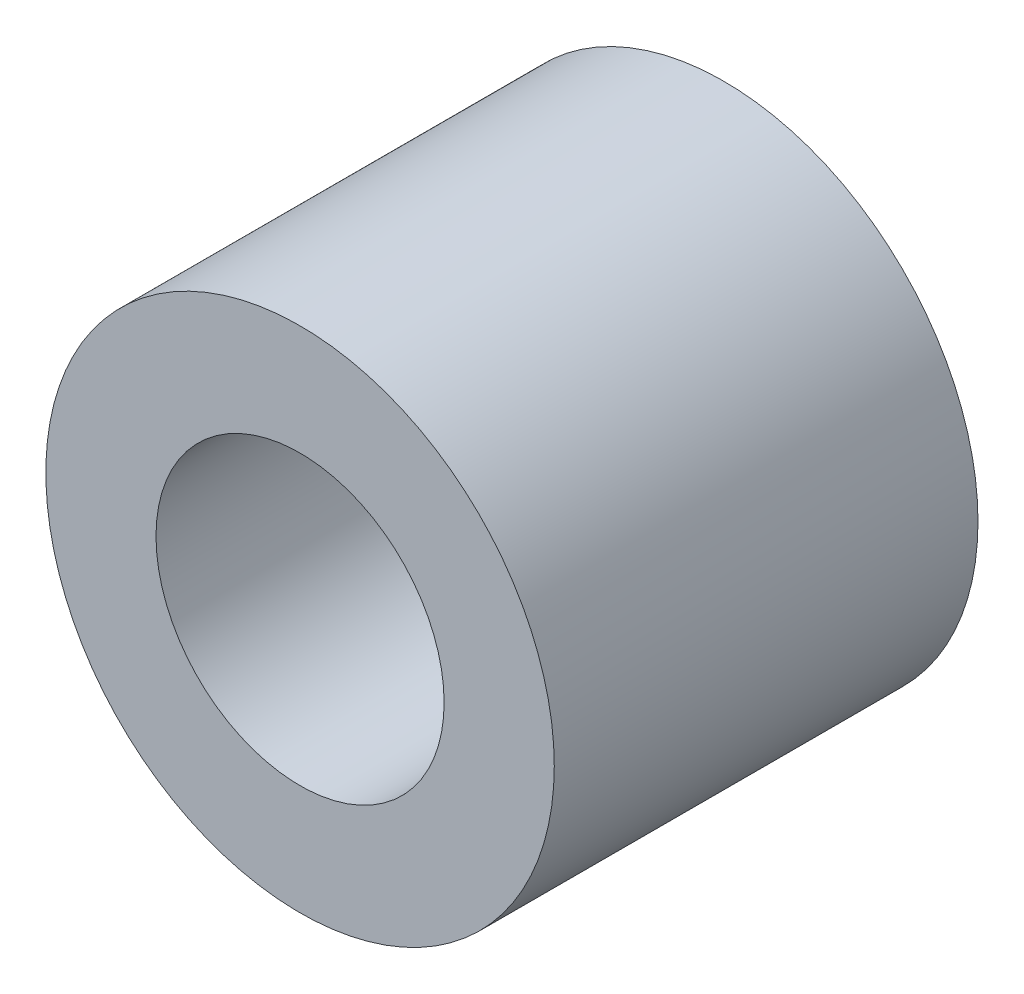
ISO-10303-21;
HEADER;
FILE_DESCRIPTION(('STEP AP214'),'2;1');
FILE_NAME('part.step','',(''),(''),'','','');
FILE_SCHEMA(('AUTOMOTIVE_DESIGN { 1 0 10303 214 1 1 1 1 }'));
ENDSEC;
DATA;
#1=APPLICATION_CONTEXT('core data for automotive mechanical design processes');
#2=APPLICATION_PROTOCOL_DEFINITION('international standard','automotive_design',2000,#1);
#3=PRODUCT_CONTEXT('',#1,'mechanical');
#4=PRODUCT('Part','Part','',(#3));
#5=PRODUCT_RELATED_PRODUCT_CATEGORY('part','',(#4));
#6=PRODUCT_DEFINITION_FORMATION('','',#4);
#7=PRODUCT_DEFINITION_CONTEXT('part definition',#1,'design');
#8=PRODUCT_DEFINITION('design','',#6,#7);
#9=PRODUCT_DEFINITION_SHAPE('','',#8);
#10=(LENGTH_UNIT() NAMED_UNIT(*) SI_UNIT(.MILLI.,.METRE.));
#11=(NAMED_UNIT(*) PLANE_ANGLE_UNIT() SI_UNIT($,.RADIAN.));
#12=(NAMED_UNIT(*) SI_UNIT($,.STERADIAN.) SOLID_ANGLE_UNIT());
#13=UNCERTAINTY_MEASURE_WITH_UNIT(LENGTH_MEASURE(1.E-05),#10,'distance_accuracy_value','');
#14=(GEOMETRIC_REPRESENTATION_CONTEXT(3) GLOBAL_UNCERTAINTY_ASSIGNED_CONTEXT((#13)) GLOBAL_UNIT_ASSIGNED_CONTEXT((#10,
#11,#12)) REPRESENTATION_CONTEXT('',''));
#15=CARTESIAN_POINT('',(0.,0.,0.));
#16=DIRECTION('',(0.,0.,1.));
#17=DIRECTION('',(1.,0.,0.));
#18=AXIS2_PLACEMENT_3D('',#15,#16,#17);
#19=CARTESIAN_POINT('',(0.,0.,5.));
#20=DIRECTION('',(0.,0.,-1.));
#21=DIRECTION('',(-1.,0.,0.));
#22=AXIS2_PLACEMENT_3D('',#19,#20,#21);
#23=CYLINDRICAL_SURFACE('',#22,3.);
#24=CARTESIAN_POINT('',(0.,0.,5.));
#25=DIRECTION('',(0.,0.,1.));
#26=DIRECTION('',(1.,0.,0.));
#27=AXIS2_PLACEMENT_3D('',#24,#25,#26);
#28=CIRCLE('',#27,3.);
#29=CARTESIAN_POINT('',(3.,0.,5.));
#30=VERTEX_POINT('',#29);
#31=EDGE_CURVE('E10',#30,#30,#28,.T.);
#32=ORIENTED_EDGE('',*,*,#31,.F.);
#33=EDGE_LOOP('',(#32));
#34=FACE_BOUND('',#33,.T.);
#35=CARTESIAN_POINT('',(0.,0.,0.));
#36=DIRECTION('',(0.,0.,1.));
#37=DIRECTION('',(1.,0.,0.));
#38=AXIS2_PLACEMENT_3D('',#35,#36,#37);
#39=CIRCLE('',#38,3.);
#40=CARTESIAN_POINT('',(3.,0.,0.));
#41=VERTEX_POINT('',#40);
#42=EDGE_CURVE('E46',#41,#41,#39,.T.);
#43=ORIENTED_EDGE('',*,*,#42,.T.);
#44=EDGE_LOOP('',(#43));
#45=FACE_BOUND('',#44,.T.);
#46=ADVANCED_FACE('F43',(#34,#45),#23,.T.);
#47=CARTESIAN_POINT('',(0.,0.,5.));
#48=DIRECTION('',(0.,0.,1.));
#49=DIRECTION('',(1.,0.,0.));
#50=AXIS2_PLACEMENT_3D('',#47,#48,#49);
#51=PLANE('',#50);
#52=CARTESIAN_POINT('',(0.,0.,5.));
#53=DIRECTION('',(0.,0.,1.));
#54=DIRECTION('',(1.,0.,0.));
#55=AXIS2_PLACEMENT_3D('',#52,#53,#54);
#56=CIRCLE('',#55,1.7);
#57=CARTESIAN_POINT('',(1.7,0.,5.));
#58=VERTEX_POINT('',#57);
#59=EDGE_CURVE('E57',#58,#58,#56,.T.);
#60=ORIENTED_EDGE('',*,*,#59,.F.);
#61=EDGE_LOOP('',(#60));
#62=FACE_BOUND('',#61,.T.);
#63=ORIENTED_EDGE('',*,*,#31,.T.);
#64=EDGE_LOOP('',(#63));
#65=FACE_BOUND('',#64,.T.);
#66=ADVANCED_FACE('F74',(#62,#65),#51,.T.);
#67=CARTESIAN_POINT('',(0.,0.,0.));
#68=DIRECTION('',(0.,0.,1.));
#69=DIRECTION('',(1.,0.,0.));
#70=AXIS2_PLACEMENT_3D('',#67,#68,#69);
#71=PLANE('',#70);
#72=CARTESIAN_POINT('',(0.,0.,0.));
#73=DIRECTION('',(0.,0.,1.));
#74=DIRECTION('',(1.,0.,0.));
#75=AXIS2_PLACEMENT_3D('',#72,#73,#74);
#76=CIRCLE('',#75,1.7);
#77=CARTESIAN_POINT('',(1.7,0.,0.));
#78=VERTEX_POINT('',#77);
#79=EDGE_CURVE('E55',#78,#78,#76,.T.);
#80=ORIENTED_EDGE('',*,*,#79,.T.);
#81=EDGE_LOOP('',(#80));
#82=FACE_BOUND('',#81,.T.);
#83=ORIENTED_EDGE('',*,*,#42,.F.);
#84=EDGE_LOOP('',(#83));
#85=FACE_BOUND('',#84,.T.);
#86=ADVANCED_FACE('F65',(#82,#85),#71,.F.);
#87=CARTESIAN_POINT('',(0.,0.,0.));
#88=DIRECTION('',(0.,0.,1.));
#89=DIRECTION('',(1.,0.,0.));
#90=AXIS2_PLACEMENT_3D('',#87,#88,#89);
#91=CYLINDRICAL_SURFACE('',#90,1.7);
#92=ORIENTED_EDGE('',*,*,#79,.F.);
#93=EDGE_LOOP('',(#92));
#94=FACE_BOUND('',#93,.T.);
#95=ORIENTED_EDGE('',*,*,#59,.T.);
#96=EDGE_LOOP('',(#95));
#97=FACE_BOUND('',#96,.T.);
#98=ADVANCED_FACE('F68',(#94,#97),#91,.F.);
#99=CLOSED_SHELL('',(#46,#66,#86,#98));
#100=MANIFOLD_SOLID_BREP('B2',#99);
#101=ADVANCED_BREP_SHAPE_REPRESENTATION('',(#18,#100),#14);
#102=SHAPE_DEFINITION_REPRESENTATION(#9,#101);
ENDSEC;
END-ISO-10303-21;
